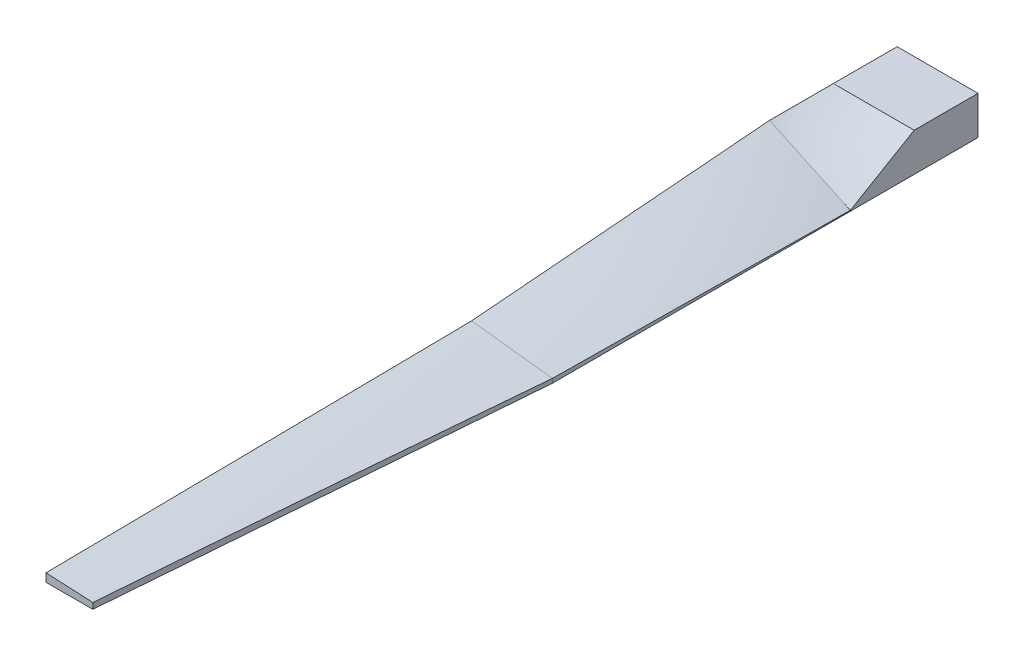
ISO-10303-21;
HEADER;
FILE_DESCRIPTION(('STEP AP214'),'2;1');
FILE_NAME('part.step','',(''),(''),'','','');
FILE_SCHEMA(('AUTOMOTIVE_DESIGN { 1 0 10303 214 1 1 1 1 }'));
ENDSEC;
DATA;
#1=APPLICATION_CONTEXT('core data for automotive mechanical design processes');
#2=APPLICATION_PROTOCOL_DEFINITION('international standard','automotive_design',2000,#1);
#3=PRODUCT_CONTEXT('',#1,'mechanical');
#4=PRODUCT('Part','Part','',(#3));
#5=PRODUCT_RELATED_PRODUCT_CATEGORY('part','',(#4));
#6=PRODUCT_DEFINITION_FORMATION('','',#4);
#7=PRODUCT_DEFINITION_CONTEXT('part definition',#1,'design');
#8=PRODUCT_DEFINITION('design','',#6,#7);
#9=PRODUCT_DEFINITION_SHAPE('','',#8);
#10=(LENGTH_UNIT() NAMED_UNIT(*) SI_UNIT(.MILLI.,.METRE.));
#11=(NAMED_UNIT(*) PLANE_ANGLE_UNIT() SI_UNIT($,.RADIAN.));
#12=(NAMED_UNIT(*) SI_UNIT($,.STERADIAN.) SOLID_ANGLE_UNIT());
#13=UNCERTAINTY_MEASURE_WITH_UNIT(LENGTH_MEASURE(1.E-05),#10,'distance_accuracy_value','');
#14=(GEOMETRIC_REPRESENTATION_CONTEXT(3) GLOBAL_UNCERTAINTY_ASSIGNED_CONTEXT((#13)) GLOBAL_UNIT_ASSIGNED_CONTEXT((#10,
#11,#12)) REPRESENTATION_CONTEXT('',''));
#15=CARTESIAN_POINT('',(0.,0.,0.));
#16=DIRECTION('',(0.,0.,1.));
#17=DIRECTION('',(1.,0.,0.));
#18=AXIS2_PLACEMENT_3D('',#15,#16,#17);
#19=CARTESIAN_POINT('',(0.,0.,0.));
#20=DIRECTION('',(0.,0.,-1.));
#21=DIRECTION('',(-1.,0.,0.));
#22=AXIS2_PLACEMENT_3D('',#19,#20,#21);
#23=PLANE('',#22);
#24=DIRECTION('',(0.,-1.,0.));
#25=VECTOR('',#24,1.);
#26=CARTESIAN_POINT('',(0.,0.,0.));
#27=LINE('',#26,#25);
#28=CARTESIAN_POINT('',(0.,45.,0.));
#29=VERTEX_POINT('',#28);
#30=CARTESIAN_POINT('',(0.,0.,0.));
#31=VERTEX_POINT('',#30);
#32=EDGE_CURVE('E326',#29,#31,#27,.T.);
#33=ORIENTED_EDGE('',*,*,#32,.F.);
#34=DIRECTION('',(-1.,0.,0.));
#35=VECTOR('',#34,1.);
#36=CARTESIAN_POINT('',(0.,45.,0.));
#37=LINE('',#36,#35);
#38=CARTESIAN_POINT('',(95.,45.,0.));
#39=VERTEX_POINT('',#38);
#40=EDGE_CURVE('E90',#39,#29,#37,.T.);
#41=ORIENTED_EDGE('',*,*,#40,.F.);
#42=DIRECTION('',(0.,1.,0.));
#43=VECTOR('',#42,1.);
#44=CARTESIAN_POINT('',(95.,0.,0.));
#45=LINE('',#44,#43);
#46=CARTESIAN_POINT('',(95.,0.,0.));
#47=VERTEX_POINT('',#46);
#48=EDGE_CURVE('E161',#47,#39,#45,.T.);
#49=ORIENTED_EDGE('',*,*,#48,.F.);
#50=DIRECTION('',(1.,0.,0.));
#51=VECTOR('',#50,1.);
#52=CARTESIAN_POINT('',(0.,0.,0.));
#53=LINE('',#52,#51);
#54=EDGE_CURVE('E154',#31,#47,#53,.T.);
#55=ORIENTED_EDGE('',*,*,#54,.F.);
#56=EDGE_LOOP('',(#33,#41,#49,#55));
#57=FACE_BOUND('',#56,.T.);
#58=ADVANCED_FACE('F67',(#57),#23,.T.);
#59=CARTESIAN_POINT('',(0.,0.,0.));
#60=DIRECTION('',(0.,1.,0.));
#61=DIRECTION('',(0.,0.,1.));
#62=AXIS2_PLACEMENT_3D('',#59,#60,#61);
#63=PLANE('',#62);
#64=DIRECTION('',(0.,0.,1.));
#65=VECTOR('',#64,1.);
#66=CARTESIAN_POINT('',(95.,0.,0.));
#67=LINE('',#66,#65);
#68=CARTESIAN_POINT('',(95.,0.,500.));
#69=VERTEX_POINT('',#68);
#70=EDGE_CURVE('E146',#47,#69,#67,.T.);
#71=ORIENTED_EDGE('',*,*,#70,.T.);
#72=DIRECTION('',(-0.07974522228289,0.,0.996815278536125));
#73=VECTOR('',#72,1.);
#74=CARTESIAN_POINT('',(134.141494435612,0.,10.731319554849));
#75=LINE('',#74,#73);
#76=CARTESIAN_POINT('',(55.,0.,1000.));
#77=VERTEX_POINT('',#76);
#78=EDGE_CURVE('E131',#69,#77,#75,.T.);
#79=ORIENTED_EDGE('',*,*,#78,.T.);
#80=DIRECTION('',(1.,0.,0.));
#81=VECTOR('',#80,1.);
#82=CARTESIAN_POINT('',(95.,0.,1000.));
#83=LINE('',#82,#81);
#84=CARTESIAN_POINT('',(0.,0.,1000.));
#85=VERTEX_POINT('',#84);
#86=EDGE_CURVE('E72',#85,#77,#83,.T.);
#87=ORIENTED_EDGE('',*,*,#86,.F.);
#88=DIRECTION('',(0.,0.,1.));
#89=VECTOR('',#88,1.);
#90=CARTESIAN_POINT('',(0.,0.,0.));
#91=LINE('',#90,#89);
#92=EDGE_CURVE('E157',#31,#85,#91,.T.);
#93=ORIENTED_EDGE('',*,*,#92,.F.);
#94=ORIENTED_EDGE('',*,*,#54,.T.);
#95=EDGE_LOOP('',(#71,#79,#87,#93,#94));
#96=FACE_BOUND('',#95,.T.);
#97=ADVANCED_FACE('F152',(#96),#63,.F.);
#98=CARTESIAN_POINT('',(0.,0.,0.));
#99=DIRECTION('',(1.,0.,0.));
#100=DIRECTION('',(0.,0.,-1.));
#101=AXIS2_PLACEMENT_3D('',#98,#99,#100);
#102=PLANE('',#101);
#103=ORIENTED_EDGE('',*,*,#92,.T.);
#104=DIRECTION('',(0.,-1.,0.));
#105=VECTOR('',#104,1.);
#106=CARTESIAN_POINT('',(0.,0.,1000.));
#107=LINE('',#106,#105);
#108=CARTESIAN_POINT('',(0.,9.66940793816975,1000.));
#109=VERTEX_POINT('',#108);
#110=EDGE_CURVE('E264',#109,#85,#107,.T.);
#111=ORIENTED_EDGE('',*,*,#110,.F.);
#112=DIRECTION('',(0.,-0.0126601694164025,0.999919856843711));
#113=VECTOR('',#112,1.);
#114=CARTESIAN_POINT('',(0.,12.8347039690849,750.));
#115=LINE('',#114,#113);
#116=CARTESIAN_POINT('',(0.,16.,500.));
#117=VERTEX_POINT('',#116);
#118=EDGE_CURVE('E218',#117,#109,#115,.T.);
#119=ORIENTED_EDGE('',*,*,#118,.F.);
#120=DIRECTION('',(0.,-0.0825741791755927,0.99658492108474));
#121=VECTOR('',#120,1.);
#122=CARTESIAN_POINT('',(0.,30.5,325.));
#123=LINE('',#122,#121);
#124=CARTESIAN_POINT('',(0.,45.,150.));
#125=VERTEX_POINT('',#124);
#126=EDGE_CURVE('E300',#125,#117,#123,.T.);
#127=ORIENTED_EDGE('',*,*,#126,.F.);
#128=DIRECTION('',(0.,0.,1.));
#129=VECTOR('',#128,1.);
#130=CARTESIAN_POINT('',(0.,45.,112.5));
#131=LINE('',#130,#129);
#132=CARTESIAN_POINT('',(0.,45.,75.));
#133=VERTEX_POINT('',#132);
#134=EDGE_CURVE('E305',#133,#125,#131,.T.);
#135=ORIENTED_EDGE('',*,*,#134,.F.);
#136=DIRECTION('',(0.,0.,1.));
#137=VECTOR('',#136,1.);
#138=CARTESIAN_POINT('',(0.,45.,0.));
#139=LINE('',#138,#137);
#140=EDGE_CURVE('E334',#29,#133,#139,.T.);
#141=ORIENTED_EDGE('',*,*,#140,.F.);
#142=ORIENTED_EDGE('',*,*,#32,.T.);
#143=EDGE_LOOP('',(#103,#111,#119,#127,#135,#141,#142));
#144=FACE_BOUND('',#143,.T.);
#145=ADVANCED_FACE('F181',(#144),#102,.F.);
#146=CARTESIAN_POINT('',(95.,0.,0.));
#147=DIRECTION('',(-1.,0.,0.));
#148=DIRECTION('',(0.,0.,1.));
#149=AXIS2_PLACEMENT_3D('',#146,#147,#148);
#150=PLANE('',#149);
#151=DIRECTION('',(0.,0.0114278251459907,0.999934700274189));
#152=VECTOR('',#151,1.);
#153=CARTESIAN_POINT('',(95.,1.,150.));
#154=LINE('',#153,#152);
#155=CARTESIAN_POINT('',(95.,1.,150.));
#156=VERTEX_POINT('',#155);
#157=CARTESIAN_POINT('',(95.,5.,500.));
#158=VERTEX_POINT('',#157);
#159=EDGE_CURVE('E149',#156,#158,#154,.T.);
#160=ORIENTED_EDGE('',*,*,#159,.T.);
#161=DIRECTION('',(0.,1.,0.));
#162=VECTOR('',#161,1.);
#163=CARTESIAN_POINT('',(95.,-0.0001,500.));
#164=LINE('',#163,#162);
#165=EDGE_CURVE('E134',#69,#158,#164,.T.);
#166=ORIENTED_EDGE('',*,*,#165,.F.);
#167=ORIENTED_EDGE('',*,*,#70,.F.);
#168=ORIENTED_EDGE('',*,*,#48,.T.);
#169=DIRECTION('',(0.,0.,1.));
#170=VECTOR('',#169,1.);
#171=CARTESIAN_POINT('',(95.,45.,0.));
#172=LINE('',#171,#170);
#173=CARTESIAN_POINT('',(95.,45.,75.));
#174=VERTEX_POINT('',#173);
#175=EDGE_CURVE('E159',#39,#174,#172,.T.);
#176=ORIENTED_EDGE('',*,*,#175,.T.);
#177=DIRECTION('',(0.,-0.506014611382858,0.862524905766236));
#178=VECTOR('',#177,1.);
#179=CARTESIAN_POINT('',(95.,45.,75.));
#180=LINE('',#179,#178);
#181=EDGE_CURVE('E304',#174,#156,#180,.T.);
#182=ORIENTED_EDGE('',*,*,#181,.T.);
#183=EDGE_LOOP('',(#160,#166,#167,#168,#176,#182));
#184=FACE_BOUND('',#183,.T.);
#185=ADVANCED_FACE('F145',(#184),#150,.F.);
#186=CARTESIAN_POINT('',(0.,45.,0.));
#187=DIRECTION('',(0.,-1.,0.));
#188=DIRECTION('',(0.,0.,-1.));
#189=AXIS2_PLACEMENT_3D('',#186,#187,#188);
#190=PLANE('',#189);
#191=ORIENTED_EDGE('',*,*,#140,.T.);
#192=DIRECTION('',(-1.,0.,0.));
#193=VECTOR('',#192,1.);
#194=CARTESIAN_POINT('',(0.,45.,75.));
#195=LINE('',#194,#193);
#196=EDGE_CURVE('E78',#174,#133,#195,.T.);
#197=ORIENTED_EDGE('',*,*,#196,.F.);
#198=ORIENTED_EDGE('',*,*,#175,.F.);
#199=ORIENTED_EDGE('',*,*,#40,.T.);
#200=EDGE_LOOP('',(#191,#197,#198,#199));
#201=FACE_BOUND('',#200,.T.);
#202=ADVANCED_FACE('F69',(#201),#190,.F.);
#203=CARTESIAN_POINT('',(94.9999999999999,45.,75.));
#204=CARTESIAN_POINT('',(95.,1.00000000000001,150.));
#205=CARTESIAN_POINT('',(79.1666666666667,45.,75.));
#206=CARTESIAN_POINT('',(79.1666666666667,8.33333333333333,150.));
#207=CARTESIAN_POINT('',(63.3333333333333,45.,75.));
#208=CARTESIAN_POINT('',(63.3333333333333,15.6666666666667,150.));
#209=CARTESIAN_POINT('',(31.6666666666667,45.,75.));
#210=CARTESIAN_POINT('',(31.6666666666667,30.3333333333333,150.));
#211=CARTESIAN_POINT('',(15.8333333333334,45.,75.));
#212=CARTESIAN_POINT('',(15.8333333333333,37.6666666666667,150.));
#213=CARTESIAN_POINT('',(0.,45.,75.));
#214=CARTESIAN_POINT('',(0.,45.,150.));
#215=B_SPLINE_SURFACE_WITH_KNOTS('',3,1,((#203,#204),(#205,#206),(#207,#208),(#209,#210),(#211,
#212),(#213,#214)),.UNSPECIFIED.,.F.,.F.,.F.,(4,2,4),(2,2),(0.,0.5,1.),(0.,1.),.UNSPECIFIED.);
#216=DIRECTION('',(-0.907399459865731,0.420269223516759,0.));
#217=VECTOR('',#216,1.);
#218=CARTESIAN_POINT('',(0.,45.,150.));
#219=LINE('',#218,#217);
#220=EDGE_CURVE('E302',#156,#125,#219,.T.);
#221=ORIENTED_EDGE('',*,*,#196,.T.);
#222=ORIENTED_EDGE('',*,*,#134,.T.);
#223=ORIENTED_EDGE('',*,*,#220,.F.);
#224=ORIENTED_EDGE('',*,*,#181,.F.);
#225=EDGE_LOOP('',(#221,#222,#223,#224));
#226=FACE_BOUND('',#225,.T.);
#227=ADVANCED_FACE('F349',(#226),#215,.T.);
#228=CARTESIAN_POINT('',(95.,1.00000000000001,150.));
#229=CARTESIAN_POINT('',(95.,5.,500.));
#230=CARTESIAN_POINT('',(79.1666666666666,8.33333333333334,150.));
#231=CARTESIAN_POINT('',(79.1666666666667,6.83333333333333,500.));
#232=CARTESIAN_POINT('',(63.3333333333333,15.6666666666667,150.));
#233=CARTESIAN_POINT('',(63.3333333333334,8.66666666666666,500.));
#234=CARTESIAN_POINT('',(31.6666666666666,30.3333333333333,150.));
#235=CARTESIAN_POINT('',(31.6666666666667,12.3333333333333,500.));
#236=CARTESIAN_POINT('',(15.8333333333333,37.6666666666667,150.));
#237=CARTESIAN_POINT('',(15.8333333333334,14.1666666666667,500.));
#238=CARTESIAN_POINT('',(0.,45.,150.));
#239=CARTESIAN_POINT('',(0.,16.,500.));
#240=B_SPLINE_SURFACE_WITH_KNOTS('',3,1,((#228,#229),(#230,#231),(#232,#233),(#234,#235),(#236,
#237),(#238,#239)),.UNSPECIFIED.,.F.,.F.,.F.,(4,2,4),(2,2),(0.,0.5,1.),(0.,1.),.UNSPECIFIED.);
#241=DIRECTION('',(-0.993363061902906,0.115020986115073,0.));
#242=VECTOR('',#241,1.);
#243=CARTESIAN_POINT('',(0.,16.,500.));
#244=LINE('',#243,#242);
#245=EDGE_CURVE('E210',#158,#117,#244,.T.);
#246=ORIENTED_EDGE('',*,*,#220,.T.);
#247=ORIENTED_EDGE('',*,*,#126,.T.);
#248=ORIENTED_EDGE('',*,*,#245,.F.);
#249=ORIENTED_EDGE('',*,*,#159,.F.);
#250=EDGE_LOOP('',(#246,#247,#248,#249));
#251=FACE_BOUND('',#250,.T.);
#252=ADVANCED_FACE('F247',(#251),#240,.T.);
#253=CARTESIAN_POINT('',(0.,0.,1000.));
#254=DIRECTION('',(0.,0.,-1.));
#255=DIRECTION('',(-1.,0.,0.));
#256=AXIS2_PLACEMENT_3D('',#253,#254,#255);
#257=PLANE('',#256);
#258=ORIENTED_EDGE('',*,*,#86,.T.);
#259=DIRECTION('',(0.,1.,0.));
#260=VECTOR('',#259,1.);
#261=CARTESIAN_POINT('',(55.,-0.0001,1000.));
#262=LINE('',#261,#260);
#263=CARTESIAN_POINT('',(55.,6.966066500282,1000.));
#264=VERTEX_POINT('',#263);
#265=EDGE_CURVE('E137',#77,#264,#262,.T.);
#266=ORIENTED_EDGE('',*,*,#265,.T.);
#267=DIRECTION('',(-0.998794241328643,0.0490923974637705,0.));
#268=VECTOR('',#267,1.);
#269=CARTESIAN_POINT('',(0.,9.66940793816975,1000.));
#270=LINE('',#269,#268);
#271=EDGE_CURVE('E226',#264,#109,#270,.T.);
#272=ORIENTED_EDGE('',*,*,#271,.T.);
#273=ORIENTED_EDGE('',*,*,#110,.T.);
#274=EDGE_LOOP('',(#258,#266,#272,#273));
#275=FACE_BOUND('',#274,.T.);
#276=ADVANCED_FACE('F236',(#275),#257,.F.);
#277=CARTESIAN_POINT('',(95.,5.,500.));
#278=CARTESIAN_POINT('',(95.,5.,1000.));
#279=CARTESIAN_POINT('',(79.1666666666667,6.83333333333333,500.));
#280=CARTESIAN_POINT('',(79.1666666666667,5.77823465636162,1000.));
#281=CARTESIAN_POINT('',(63.3333333333334,8.66666666666666,500.));
#282=CARTESIAN_POINT('',(63.3333333333334,6.55646931272325,1000.));
#283=CARTESIAN_POINT('',(31.6666666666667,12.3333333333333,500.));
#284=CARTESIAN_POINT('',(31.6666666666667,8.1129386254465,1000.));
#285=CARTESIAN_POINT('',(15.8333333333334,14.1666666666667,500.));
#286=CARTESIAN_POINT('',(15.8333333333334,8.89117328180812,1000.));
#287=CARTESIAN_POINT('',(0.,16.,500.));
#288=CARTESIAN_POINT('',(0.,9.66940793816975,1000.));
#289=B_SPLINE_SURFACE_WITH_KNOTS('',3,1,((#277,#278),(#279,#280),(#281,#282),(#283,#284),(#285,
#286),(#287,#288)),.UNSPECIFIED.,.F.,.F.,.F.,(4,2,4),(2,2),(0.,0.5,1.),(0.,1.),.UNSPECIFIED.);
#290=CARTESIAN_POINT('',(95.,5.,500.));
#291=CARTESIAN_POINT('',(89.9159269478693,5.58868544169421,563.550913151634));
#292=CARTESIAN_POINT('',(84.8317601327885,6.04819230699579,627.102998340143));
#293=CARTESIAN_POINT('',(75.6230130184005,6.6464824729469,742.212337269994));
#294=CARTESIAN_POINT('',(71.4984507588442,6.82943301709932,793.769365514448));
#295=CARTESIAN_POINT('',(63.2492559825178,7.02528881177581,896.884300218528));
#296=CARTESIAN_POINT('',(59.1246234654701,7.03819222423886,948.442206681624));
#297=CARTESIAN_POINT('',(55.,6.966066500282,1000.));
#298=B_SPLINE_CURVE_WITH_KNOTS('',3,(#290,#291,#292,#293,#294,#295,#296,#297),.UNSPECIFIED.,.F.,
.F.,(4,2,2,4),(0.,191.269836072016,346.435775092545,501.603391320013),.UNSPECIFIED.);
#299=EDGE_CURVE('E12',#158,#264,#298,.T.);
#300=ORIENTED_EDGE('',*,*,#299,.F.);
#301=ORIENTED_EDGE('',*,*,#245,.T.);
#302=ORIENTED_EDGE('',*,*,#118,.T.);
#303=ORIENTED_EDGE('',*,*,#271,.F.);
#304=EDGE_LOOP('',(#300,#301,#302,#303));
#305=FACE_BOUND('',#304,.T.);
#306=ADVANCED_FACE('F246',(#305),#289,.T.);
#307=CARTESIAN_POINT('',(55.,-0.0001,1000.));
#308=DIRECTION('',(-0.996815278536125,0.,-0.07974522228289));
#309=DIRECTION('',(-0.07974522228289,0.,0.996815278536125));
#310=AXIS2_PLACEMENT_3D('',#307,#308,#309);
#311=PLANE('',#310);
#312=ORIENTED_EDGE('',*,*,#165,.T.);
#313=ORIENTED_EDGE('',*,*,#299,.T.);
#314=ORIENTED_EDGE('',*,*,#265,.F.);
#315=ORIENTED_EDGE('',*,*,#78,.F.);
#316=EDGE_LOOP('',(#312,#313,#314,#315));
#317=FACE_BOUND('',#316,.T.);
#318=ADVANCED_FACE('F133',(#317),#311,.F.);
#319=CLOSED_SHELL('',(#58,#97,#145,#185,#202,#227,#252,#276,#306,#318));
#320=MANIFOLD_SOLID_BREP('B2',#319);
#321=ADVANCED_BREP_SHAPE_REPRESENTATION('',(#18,#320),#14);
#322=SHAPE_DEFINITION_REPRESENTATION(#9,#321);
ENDSEC;
END-ISO-10303-21;
